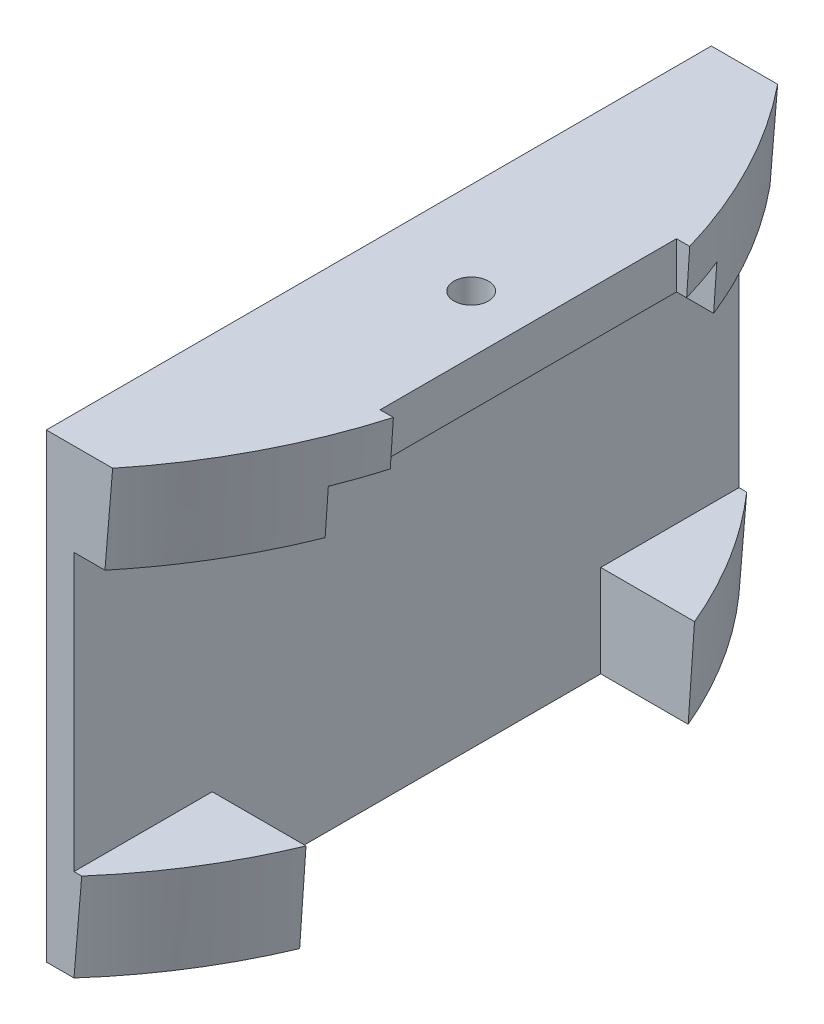
ISO-10303-21;
HEADER;
FILE_DESCRIPTION(('STEP AP214'),'2;1');
FILE_NAME('part.step','',(''),(''),'','','');
FILE_SCHEMA(('AUTOMOTIVE_DESIGN { 1 0 10303 214 1 1 1 1 }'));
ENDSEC;
DATA;
#1=APPLICATION_CONTEXT('core data for automotive mechanical design processes');
#2=APPLICATION_PROTOCOL_DEFINITION('international standard','automotive_design',2000,#1);
#3=PRODUCT_CONTEXT('',#1,'mechanical');
#4=PRODUCT('Part','Part','',(#3));
#5=PRODUCT_RELATED_PRODUCT_CATEGORY('part','',(#4));
#6=PRODUCT_DEFINITION_FORMATION('','',#4);
#7=PRODUCT_DEFINITION_CONTEXT('part definition',#1,'design');
#8=PRODUCT_DEFINITION('design','',#6,#7);
#9=PRODUCT_DEFINITION_SHAPE('','',#8);
#10=(LENGTH_UNIT() NAMED_UNIT(*) SI_UNIT(.MILLI.,.METRE.));
#11=(NAMED_UNIT(*) PLANE_ANGLE_UNIT() SI_UNIT($,.RADIAN.));
#12=(NAMED_UNIT(*) SI_UNIT($,.STERADIAN.) SOLID_ANGLE_UNIT());
#13=UNCERTAINTY_MEASURE_WITH_UNIT(LENGTH_MEASURE(1.E-05),#10,'distance_accuracy_value','');
#14=(GEOMETRIC_REPRESENTATION_CONTEXT(3) GLOBAL_UNCERTAINTY_ASSIGNED_CONTEXT((#13)) GLOBAL_UNIT_ASSIGNED_CONTEXT((#10,
#11,#12)) REPRESENTATION_CONTEXT('',''));
#15=CARTESIAN_POINT('',(0.,0.,0.));
#16=DIRECTION('',(0.,0.,1.));
#17=DIRECTION('',(1.,0.,0.));
#18=AXIS2_PLACEMENT_3D('',#15,#16,#17);
#19=CARTESIAN_POINT('',(51.3680584697573,0.,45.8196696304937));
#20=CARTESIAN_POINT('',(56.6981153033539,63.5,45.8196696304937));
#21=CARTESIAN_POINT('',(75.8413427747127,0.,18.3828699053536));
#22=CARTESIAN_POINT('',(79.2371077156288,63.5,17.9294992971375));
#23=CARTESIAN_POINT('',(75.8413427747127,0.,-18.3828699053536));
#24=CARTESIAN_POINT('',(79.2371077156288,63.5,-17.9294992971375));
#25=CARTESIAN_POINT('',(51.3680584697573,0.,-45.8196696304937));
#26=CARTESIAN_POINT('',(56.6981153033539,63.5,-45.8196696304937));
#27=(BOUNDED_SURFACE() B_SPLINE_SURFACE(3,1,((#19,#20),(#21,#22),(#23,#24),(#25,#26)),
.UNSPECIFIED.,.F.,.F.,.F.) B_SPLINE_SURFACE_WITH_KNOTS((4,4),(2,2),(0.,1.),(0.,1.),
.UNSPECIFIED.) GEOMETRIC_REPRESENTATION_ITEM() RATIONAL_B_SPLINE_SURFACE(((1.,1.),
(0.830839977043877,0.851848841791305),(0.830839977043877,0.851848841791305),(1.,1.))) REPRESENTATION_ITEM('') SURFACE());
#28=CARTESIAN_POINT('',(55.6321039366345,50.8,-45.8196696304937));
#29=CARTESIAN_POINT('',(56.497908368084,50.8,-44.7694605796605));
#30=CARTESIAN_POINT('',(57.3338879136072,50.8,-43.6946705729328));
#31=CARTESIAN_POINT('',(58.9440977250805,50.8,-41.4989027763207));
#32=CARTESIAN_POINT('',(59.7182946589383,50.8,-40.3779005426618));
#33=CARTESIAN_POINT('',(61.2021036492706,50.8,-38.0935118665906));
#34=CARTESIAN_POINT('',(61.9116984696572,50.8,-36.9301142281833));
#35=CARTESIAN_POINT('',(63.252519686937,50.8,-34.5846856778874));
#36=CARTESIAN_POINT('',(63.8848556064201,50.8,-33.4032890028458));
#37=CARTESIAN_POINT('',(65.082476259836,50.8,-31.007497624037));
#38=CARTESIAN_POINT('',(65.6477828435403,50.8,-29.7931138327185));
#39=CARTESIAN_POINT('',(66.709538823984,50.8,-27.3353827015068));
#40=CARTESIAN_POINT('',(67.2060307120814,50.8,-26.0920537935149));
#41=CARTESIAN_POINT('',(67.8052413600401,50.8,-24.4609603346704));
#42=CARTESIAN_POINT('',(67.9399122326129,50.8,-24.0847301337823));
#43=CARTESIAN_POINT('',(68.2029603334052,50.8,-23.3301221267811));
#44=CARTESIAN_POINT('',(68.3313384046149,50.8,-22.9517446159431));
#45=CARTESIAN_POINT('',(68.5822020018238,50.8,-22.1916277214967));
#46=CARTESIAN_POINT('',(68.704666183154,50.8,-21.8098813021193));
#47=CARTESIAN_POINT('',(68.9432198316352,50.8,-21.0443460046086));
#48=CARTESIAN_POINT('',(69.0593084466032,50.8,-20.6605568609208));
#49=CARTESIAN_POINT('',(69.1721844661229,50.8,-20.2758238921324));
#50=B_SPLINE_CURVE_WITH_KNOTS('',3,(#28,#29,#30,#31,#32,#33,#34,#35,#36,#37,#38,#39,#40,#41,#42,
#43,#44,#45,#46,#47,#48,#49),.UNSPECIFIED.,.F.,.F.,(4,2,2,2,2,2,2,2,2,2,4),(0.,4.08270614711515,
8.16760025355881,12.2535810506451,16.2714254319827,20.28795648173,24.3019962682621,
25.500784328937,26.6994113573589,27.9020828692834,29.1049147456352),.UNSPECIFIED.);
#51=CARTESIAN_POINT('',(55.6321039366345,50.8,-45.8196696304937));
#52=VERTEX_POINT('',#51);
#53=CARTESIAN_POINT('',(66.9253802718415,50.8,-26.7696696304937));
#54=VERTEX_POINT('',#53);
#55=EDGE_CURVE('E542',#52,#54,#50,.T.);
#56=DIRECTION('',(0.0836437610301086,0.99649572063343,0.));
#57=VECTOR('',#56,1.);
#58=CARTESIAN_POINT('',(54.0330868865556,31.75,-45.8196696304937));
#59=LINE('',#58,#57);
#60=CARTESIAN_POINT('',(56.6981153033539,63.5,-45.8196696304937));
#61=VERTEX_POINT('',#60);
#62=EDGE_CURVE('E298',#52,#61,#59,.T.);
#63=CARTESIAN_POINT('',(0.,63.5,0.));
#64=DIRECTION('',(0.,1.,0.));
#65=DIRECTION('',(0.,0.,1.));
#66=AXIS2_PLACEMENT_3D('',#63,#64,#65);
#67=CIRCLE('',#66,72.898);
#68=CARTESIAN_POINT('',(69.9796788547912,63.5,-20.4196696304937));
#69=VERTEX_POINT('',#68);
#70=EDGE_CURVE('E383',#69,#61,#67,.T.);
#71=CARTESIAN_POINT('',(69.9796791660371,63.5,-20.4196696304937));
#72=CARTESIAN_POINT('',(69.6749476855377,58.9475895332378,-20.4196696304937));
#73=CARTESIAN_POINT('',(69.3703155313551,54.3951724220756,-20.4196696304937));
#74=CARTESIAN_POINT('',(68.7612498756235,45.2903249109514,-20.4196696304937));
#75=CARTESIAN_POINT('',(68.4568163740745,40.7378945109893,-20.4196696304937));
#76=CARTESIAN_POINT('',(68.1524821988424,36.1854574666273,-20.4196696304937));
#77=B_SPLINE_CURVE_WITH_KNOTS('',3,(#71,#72,#73,#74,#75,#76),.UNSPECIFIED.,.F.,.F.,(4,2,4),(0.,
13.6877945897167,27.3755891794333),.UNSPECIFIED.);
#78=CARTESIAN_POINT('',(69.5546840336311,57.15,-20.4196696304937));
#79=VERTEX_POINT('',#78);
#80=EDGE_CURVE('E228',#69,#79,#77,.T.);
#81=CARTESIAN_POINT('',(67.3650346924501,57.15,26.7696696304937));
#82=CARTESIAN_POINT('',(67.7411460159018,57.15,25.8237190961142));
#83=CARTESIAN_POINT('',(68.0972983772991,57.15,24.8698342132706));
#84=CARTESIAN_POINT('',(68.7691054061984,57.15,22.9479181310189));
#85=CARTESIAN_POINT('',(69.084760442982,57.15,21.9798870606949));
#86=CARTESIAN_POINT('',(69.6749992556651,57.15,20.0313859066843));
#87=CARTESIAN_POINT('',(69.9495831259176,57.15,19.0509158515794));
#88=CARTESIAN_POINT('',(70.4571972371561,57.15,17.0792728656308));
#89=CARTESIAN_POINT('',(70.6902272866677,57.15,16.0880998854917));
#90=CARTESIAN_POINT('',(71.114554906625,57.15,14.0956954395073));
#91=CARTESIAN_POINT('',(71.3058052769937,57.15,13.0944539204511));
#92=CARTESIAN_POINT('',(71.6458967582875,57.15,11.0848155340853));
#93=CARTESIAN_POINT('',(71.7947386819823,57.15,10.0764188042869));
#94=CARTESIAN_POINT('',(72.0497489791781,57.15,8.05426586707902));
#95=CARTESIAN_POINT('',(72.1559185289903,57.15,7.04050980818592));
#96=CARTESIAN_POINT('',(72.3253982746394,57.15,5.00948176657829));
#97=CARTESIAN_POINT('',(72.3887100225621,57.15,3.99220991252867));
#98=CARTESIAN_POINT('',(72.4863387624392,57.15,1.61564774644313));
#99=CARTESIAN_POINT('',(72.5039025678789,57.15,0.255635089755667));
#100=CARTESIAN_POINT('',(72.4624803083652,57.15,-2.46325768152241));
#101=CARTESIAN_POINT('',(72.4034900288574,57.15,-3.82213772963784));
#102=CARTESIAN_POINT('',(72.2091307463837,57.15,-6.53463440636639));
#103=CARTESIAN_POINT('',(72.0737505495139,57.15,-7.88825023430229));
#104=CARTESIAN_POINT('',(71.7274147059183,57.15,-10.5827216569042));
#105=CARTESIAN_POINT('',(71.5166278106926,57.15,-11.9235989352914));
#106=CARTESIAN_POINT('',(71.0201472784015,57.15,-14.5911671693912));
#107=CARTESIAN_POINT('',(70.7344654604159,57.15,-15.9178603291319));
#108=CARTESIAN_POINT('',(70.0892258904803,57.15,-18.552457885756));
#109=CARTESIAN_POINT('',(69.7297106948473,57.15,-19.860372643632));
#110=CARTESIAN_POINT('',(69.1889805906471,57.15,-21.6315082034966));
#111=CARTESIAN_POINT('',(69.0392412485226,57.15,-22.1045154046806));
#112=CARTESIAN_POINT('',(68.7301035194749,57.15,-23.0472827867813));
#113=CARTESIAN_POINT('',(68.5707068846321,57.15,-23.5170435395603));
#114=CARTESIAN_POINT('',(68.2424855733698,57.15,-24.4526637787048));
#115=CARTESIAN_POINT('',(68.0736716818402,57.15,-24.9185270526523));
#116=CARTESIAN_POINT('',(67.7264931972547,57.15,-25.8467762034833));
#117=CARTESIAN_POINT('',(67.5481268998495,57.15,-26.3091614429159));
#118=CARTESIAN_POINT('',(67.3650346924501,57.15,-26.7696696304937));
#119=B_SPLINE_CURVE_WITH_KNOTS('',3,(#81,#82,#83,#84,#85,#86,#87,#88,#89,#90,#91,#92,#93,#94,
#95,#96,#97,#98,#99,#100,#101,#102,#103,#104,#105,#106,#107,#108,#109,#110,#111,#112,#113,#114,
#115,#116,#117,#118),.UNSPECIFIED.,.F.,.F.,(4,2,2,2,2,2,2,2,2,2,2,2,2,2,2,2,2,2,4),(0.,
3.05371064757176,6.10739344739349,9.16106923186193,12.2147590868853,15.2718811712091,
18.3289446609978,21.3859238736832,24.4427923726147,28.5209179060169,32.5992679631736,
36.6782158023411,40.7480919498584,44.8173262212102,48.8842216040591,50.3725784550399,
51.8606660838535,53.3470831712097,54.8337663558255),.UNSPECIFIED.);
#120=CARTESIAN_POINT('',(67.3650346924501,57.15,-26.7696696304937));
#121=VERTEX_POINT('',#120);
#122=EDGE_CURVE('E275',#79,#121,#119,.T.);
#123=CARTESIAN_POINT('',(63.4153320883382,0.,-26.7696696304937));
#124=CARTESIAN_POINT('',(64.0722790866244,9.52509229181283,-26.7696696304937));
#125=CARTESIAN_POINT('',(64.7298944662095,19.050138391021,-26.7696696304937));
#126=CARTESIAN_POINT('',(66.0464620008872,38.1001383910228,-26.7696696304937));
#127=CARTESIAN_POINT('',(66.7054141560061,47.6250922918147,-26.7696696304937));
#128=CARTESIAN_POINT('',(67.3650346924501,57.15,-26.7696696304937));
#129=B_SPLINE_CURVE_WITH_KNOTS('',3,(#123,#124,#125,#126,#127,#128),.UNSPECIFIED.,.F.,.F.,(4,2,
4),(0.,28.6431606254541,57.2863218126295),.UNSPECIFIED.);
#130=EDGE_CURVE('E274',#54,#121,#129,.T.);
#131=ORIENTED_EDGE('',*,*,#55,.F.);
#132=ORIENTED_EDGE('',*,*,#62,.T.);
#133=ORIENTED_EDGE('',*,*,#70,.F.);
#134=ORIENTED_EDGE('',*,*,#80,.T.);
#135=ORIENTED_EDGE('',*,*,#122,.T.);
#136=ORIENTED_EDGE('',*,*,#130,.F.);
#137=EDGE_LOOP('',(#131,#132,#133,#134,#135,#136));
#138=FACE_BOUND('',#137,.T.);
#139=ADVANCED_FACE('F44',(#138),#27,.T.);
#140=CARTESIAN_POINT('',(69.1721844661229,50.8,20.2758238921323));
#141=CARTESIAN_POINT('',(68.7890499407735,50.8,21.5818768298051));
#142=CARTESIAN_POINT('',(68.3688129929237,50.8,22.8770393446531));
#143=CARTESIAN_POINT('',(67.4554297473611,50.8,25.4421717200295));
#144=CARTESIAN_POINT('',(66.9622448285752,50.8,26.7121278290174));
#145=CARTESIAN_POINT('',(65.9045315665793,50.8,29.222371141385));
#146=CARTESIAN_POINT('',(65.33998437336,50.8,30.4626504024415));
#147=CARTESIAN_POINT('',(64.151473582279,50.8,32.8888114524856));
#148=CARTESIAN_POINT('',(63.5286574561361,50.8,34.0752554073096));
#149=CARTESIAN_POINT('',(62.2180829406557,50.8,36.4111757374231));
#150=CARTESIAN_POINT('',(61.5303457674589,50.8,37.5606640262958));
#151=CARTESIAN_POINT('',(60.0922628164254,50.8,39.8189189019977));
#152=CARTESIAN_POINT('',(59.3419561006168,50.8,40.927710282237));
#153=CARTESIAN_POINT('',(58.3284014751663,50.8,42.3391762862144));
#154=CARTESIAN_POINT('',(58.0926258471345,50.8,42.6618138446394));
#155=CARTESIAN_POINT('',(57.6157664740547,50.8,43.3030872140876));
#156=CARTESIAN_POINT('',(57.3746834472036,50.8,43.6217235575019));
#157=CARTESIAN_POINT('',(56.8864297870776,50.8,44.2560080907484));
#158=CARTESIAN_POINT('',(56.6392413607275,50.8,44.5716425735946));
#159=CARTESIAN_POINT('',(56.1395981364055,50.8,45.1987842489404));
#160=CARTESIAN_POINT('',(55.8871426398372,50.8,45.5102908848689));
#161=CARTESIAN_POINT('',(55.6321039366346,50.8,45.8196696304937));
#162=B_SPLINE_CURVE_WITH_KNOTS('',3,(#140,#141,#142,#143,#144,#145,#146,#147,#148,#149,#150,
#151,#152,#153,#154,#155,#156,#157,#158,#159,#160,#161),.UNSPECIFIED.,.F.,.F.,(4,2,2,2,2,2,2,2,
2,2,4),(0.,4.08271567284874,8.16760065929459,12.2535669125204,16.2714139012287,20.2879523769718,
24.3020018439877,25.5007889320795,26.6994147855325,27.9020842518857,29.1049142610503),.UNSPECIFIED.);
#163=CARTESIAN_POINT('',(66.9253802718415,50.8,26.7696696304937));
#164=VERTEX_POINT('',#163);
#165=CARTESIAN_POINT('',(55.6321039366346,50.8,45.8196696304937));
#166=VERTEX_POINT('',#165);
#167=EDGE_CURVE('E214',#164,#166,#162,.T.);
#168=CARTESIAN_POINT('',(63.4153320883382,0.,26.7696696304937));
#169=CARTESIAN_POINT('',(64.0722790866244,9.52509229181282,26.7696696304937));
#170=CARTESIAN_POINT('',(64.7298944662095,19.050138391021,26.7696696304937));
#171=CARTESIAN_POINT('',(66.0464620008872,38.1001383910228,26.7696696304937));
#172=CARTESIAN_POINT('',(66.7054141560061,47.6250922918146,26.7696696304937));
#173=CARTESIAN_POINT('',(67.3650346924501,57.15,26.7696696304937));
#174=B_SPLINE_CURVE_WITH_KNOTS('',3,(#168,#169,#170,#171,#172,#173),.UNSPECIFIED.,.F.,.F.,(4,2,
4),(0.,28.6431606254541,57.2863218126295),.UNSPECIFIED.);
#175=CARTESIAN_POINT('',(67.3650346924501,57.15,26.7696696304937));
#176=VERTEX_POINT('',#175);
#177=EDGE_CURVE('E282',#164,#176,#174,.T.);
#178=CARTESIAN_POINT('',(69.5546840336311,57.15,20.4196696304937));
#179=VERTEX_POINT('',#178);
#180=EDGE_CURVE('E266',#176,#179,#119,.T.);
#181=CARTESIAN_POINT('',(69.9796791660371,63.5,20.4196696304937));
#182=CARTESIAN_POINT('',(69.6749476855377,58.9475895332378,20.4196696304937));
#183=CARTESIAN_POINT('',(69.3703155313551,54.3951724220756,20.4196696304937));
#184=CARTESIAN_POINT('',(68.7612498756235,45.2903249109513,20.4196696304937));
#185=CARTESIAN_POINT('',(68.4568163740746,40.7378945109892,20.4196696304937));
#186=CARTESIAN_POINT('',(68.1524821988424,36.1854574666272,20.4196696304937));
#187=B_SPLINE_CURVE_WITH_KNOTS('',3,(#181,#182,#183,#184,#185,#186),.UNSPECIFIED.,.F.,.F.,(4,2,
4),(0.,13.6877945897167,27.3755891794334),.UNSPECIFIED.);
#188=CARTESIAN_POINT('',(69.9796823682284,63.5,20.4196696304937));
#189=VERTEX_POINT('',#188);
#190=EDGE_CURVE('E231',#189,#179,#187,.T.);
#191=CARTESIAN_POINT('',(56.6981153033539,63.5,45.8196696304937));
#192=VERTEX_POINT('',#191);
#193=EDGE_CURVE('E295',#192,#189,#67,.T.);
#194=DIRECTION('',(0.0836437610301085,0.99649572063343,0.));
#195=VECTOR('',#194,1.);
#196=CARTESIAN_POINT('',(51.3680584697573,0.,45.8196696304937));
#197=LINE('',#196,#195);
#198=EDGE_CURVE('E49',#166,#192,#197,.T.);
#199=ORIENTED_EDGE('',*,*,#167,.F.);
#200=ORIENTED_EDGE('',*,*,#177,.T.);
#201=ORIENTED_EDGE('',*,*,#180,.T.);
#202=ORIENTED_EDGE('',*,*,#190,.F.);
#203=ORIENTED_EDGE('',*,*,#193,.F.);
#204=ORIENTED_EDGE('',*,*,#198,.F.);
#205=EDGE_LOOP('',(#199,#200,#201,#202,#203,#204));
#206=FACE_BOUND('',#205,.T.);
#207=ADVANCED_FACE('F446',(#206),#27,.T.);
#208=CARTESIAN_POINT('',(0.,57.15,26.7696696304937));
#209=DIRECTION('',(0.,0.,-1.));
#210=DIRECTION('',(-1.,0.,0.));
#211=AXIS2_PLACEMENT_3D('',#208,#209,#210);
#212=PLANE('',#211);
#213=DIRECTION('',(1.,0.,0.));
#214=VECTOR('',#213,1.);
#215=CARTESIAN_POINT('',(0.,50.8,26.7696696304937));
#216=LINE('',#215,#214);
#217=CARTESIAN_POINT('',(51.3680584697573,50.8,26.7696696304937));
#218=VERTEX_POINT('',#217);
#219=EDGE_CURVE('E549',#218,#164,#216,.T.);
#220=ORIENTED_EDGE('',*,*,#219,.F.);
#221=DIRECTION('',(0.,-1.,0.));
#222=VECTOR('',#221,1.);
#223=CARTESIAN_POINT('',(51.3680584697573,57.15,26.7696696304937));
#224=LINE('',#223,#222);
#225=CARTESIAN_POINT('',(51.3680584697573,57.15,26.7696696304937));
#226=VERTEX_POINT('',#225);
#227=EDGE_CURVE('E488',#226,#218,#224,.T.);
#228=ORIENTED_EDGE('',*,*,#227,.F.);
#229=DIRECTION('',(1.,0.,0.));
#230=VECTOR('',#229,1.);
#231=CARTESIAN_POINT('',(0.,57.15,26.7696696304937));
#232=LINE('',#231,#230);
#233=EDGE_CURVE('E471',#226,#176,#232,.T.);
#234=ORIENTED_EDGE('',*,*,#233,.T.);
#235=ORIENTED_EDGE('',*,*,#177,.F.);
#236=EDGE_LOOP('',(#220,#228,#234,#235));
#237=FACE_BOUND('',#236,.T.);
#238=ADVANCED_FACE('F316',(#237),#212,.T.);
#239=CARTESIAN_POINT('',(0.,57.15,-26.7696696304937));
#240=DIRECTION('',(0.,0.,-1.));
#241=DIRECTION('',(-1.,0.,0.));
#242=AXIS2_PLACEMENT_3D('',#239,#240,#241);
#243=PLANE('',#242);
#244=DIRECTION('',(0.,-1.,0.));
#245=VECTOR('',#244,1.);
#246=CARTESIAN_POINT('',(51.3680584697574,57.15,-26.7696696304937));
#247=LINE('',#246,#245);
#248=CARTESIAN_POINT('',(51.3680584697574,57.15,-26.7696696304937));
#249=VERTEX_POINT('',#248);
#250=CARTESIAN_POINT('',(51.3680584697573,50.8,-26.7696696304937));
#251=VERTEX_POINT('',#250);
#252=EDGE_CURVE('E371',#249,#251,#247,.T.);
#253=ORIENTED_EDGE('',*,*,#252,.T.);
#254=DIRECTION('',(1.,0.,0.));
#255=VECTOR('',#254,1.);
#256=CARTESIAN_POINT('',(0.,50.8,-26.7696696304937));
#257=LINE('',#256,#255);
#258=EDGE_CURVE('E539',#251,#54,#257,.T.);
#259=ORIENTED_EDGE('',*,*,#258,.T.);
#260=ORIENTED_EDGE('',*,*,#130,.T.);
#261=DIRECTION('',(1.,0.,0.));
#262=VECTOR('',#261,1.);
#263=CARTESIAN_POINT('',(0.,57.15,-26.7696696304937));
#264=LINE('',#263,#262);
#265=EDGE_CURVE('E493',#249,#121,#264,.T.);
#266=ORIENTED_EDGE('',*,*,#265,.F.);
#267=EDGE_LOOP('',(#253,#259,#260,#266));
#268=FACE_BOUND('',#267,.T.);
#269=ADVANCED_FACE('F460',(#268),#243,.F.);
#270=CARTESIAN_POINT('',(66.5723135146819,12.7,-20.4555103290778));
#271=CARTESIAN_POINT('',(66.1856502337997,12.7,-21.7129181344014));
#272=CARTESIAN_POINT('',(65.7632541532432,12.7,-22.9593315428074));
#273=CARTESIAN_POINT('',(64.8483094879216,12.7,-25.4268378925729));
#274=CARTESIAN_POINT('',(64.3557264567147,12.7,-26.6479180617382));
#275=CARTESIAN_POINT('',(63.3019757531598,12.7,-29.0604755538159));
#276=CARTESIAN_POINT('',(62.740791303523,12.7,-30.2519455491363));
#277=CARTESIAN_POINT('',(61.5620608571998,12.7,-32.5807827925924));
#278=CARTESIAN_POINT('',(60.9456601822129,12.7,-33.7187298145751));
#279=CARTESIAN_POINT('',(59.6506150591967,12.7,-35.9581426451127));
#280=CARTESIAN_POINT('',(58.9719897862136,12.7,-37.0596195507854));
#281=CARTESIAN_POINT('',(57.5547858413439,12.7,-39.2225045674054));
#282=CARTESIAN_POINT('',(56.8162422979353,12.7,-40.2839356289554));
#283=CARTESIAN_POINT('',(55.763899123842,12.7,-41.7099658367448));
#284=CARTESIAN_POINT('',(55.4749804175874,12.7,-42.0931206117331));
#285=CARTESIAN_POINT('',(54.8893207060376,12.7,-42.8533258493937));
#286=CARTESIAN_POINT('',(54.5925809324625,12.7,-43.2303772583499));
#287=CARTESIAN_POINT('',(53.9900599329966,12.7,-43.979893608158));
#288=CARTESIAN_POINT('',(53.6842449073304,12.7,-44.3523313600675));
#289=CARTESIAN_POINT('',(53.0649002920439,12.7,-45.090834723148));
#290=CARTESIAN_POINT('',(52.7513695117862,12.7,-45.4568993357931));
#291=CARTESIAN_POINT('',(52.4340698364766,12.7,-45.8196696304937));
#292=B_SPLINE_CURVE_WITH_KNOTS('',3,(#270,#271,#272,#273,#274,#275,#276,#277,#278,#279,#280,
#281,#282,#283,#284,#285,#286,#287,#288,#289,#290,#291),.UNSPECIFIED.,.F.,.F.,(4,2,2,2,2,2,2,2,
2,2,4),(0.,3.94601181867589,7.89396697960341,11.8428895985965,15.723375504018,19.6026695975417,
23.479705575766,24.9192646060437,26.3585982627226,27.8042118634496,29.2500499568141),.UNSPECIFIED.);
#293=CARTESIAN_POINT('',(64.2916542193554,12.7,-26.7696696304937));
#294=VERTEX_POINT('',#293);
#295=CARTESIAN_POINT('',(52.4340698364766,12.7,-45.8196696304937));
#296=VERTEX_POINT('',#295);
#297=EDGE_CURVE('E185',#294,#296,#292,.T.);
#298=CARTESIAN_POINT('',(63.4153320883382,0.,-26.7696696304937));
#299=VERTEX_POINT('',#298);
#300=EDGE_CURVE('E279',#299,#294,#129,.T.);
#301=CARTESIAN_POINT('',(0.,0.,0.));
#302=DIRECTION('',(0.,1.,0.));
#303=DIRECTION('',(0.,0.,1.));
#304=AXIS2_PLACEMENT_3D('',#301,#302,#303);
#305=CIRCLE('',#304,68.834);
#306=CARTESIAN_POINT('',(51.3680584697573,0.,-45.8196696304937));
#307=VERTEX_POINT('',#306);
#308=EDGE_CURVE('E369',#299,#307,#305,.T.);
#309=EDGE_CURVE('E415',#307,#296,#59,.T.);
#310=ORIENTED_EDGE('',*,*,#297,.F.);
#311=ORIENTED_EDGE('',*,*,#300,.F.);
#312=ORIENTED_EDGE('',*,*,#308,.T.);
#313=ORIENTED_EDGE('',*,*,#309,.T.);
#314=EDGE_LOOP('',(#310,#311,#312,#313));
#315=FACE_BOUND('',#314,.T.);
#316=ADVANCED_FACE('F321',(#315),#27,.T.);
#317=CARTESIAN_POINT('',(0.,0.,0.));
#318=DIRECTION('',(0.,1.,0.));
#319=DIRECTION('',(0.,0.,1.));
#320=AXIS2_PLACEMENT_3D('',#317,#318,#319);
#321=PLANE('',#320);
#322=DIRECTION('',(1.,0.,0.));
#323=VECTOR('',#322,1.);
#324=CARTESIAN_POINT('',(0.,0.,26.7696696304937));
#325=LINE('',#324,#323);
#326=CARTESIAN_POINT('',(51.3680584697573,0.,26.7696696304937));
#327=VERTEX_POINT('',#326);
#328=CARTESIAN_POINT('',(63.4153320883382,0.,26.7696696304937));
#329=VERTEX_POINT('',#328);
#330=EDGE_CURVE('E477',#327,#329,#325,.T.);
#331=ORIENTED_EDGE('',*,*,#330,.T.);
#332=CARTESIAN_POINT('',(51.3680584697573,0.,45.8196696304937));
#333=VERTEX_POINT('',#332);
#334=EDGE_CURVE('E307',#333,#329,#305,.T.);
#335=ORIENTED_EDGE('',*,*,#334,.F.);
#336=DIRECTION('',(1.,0.,0.));
#337=VECTOR('',#336,1.);
#338=CARTESIAN_POINT('',(47.5580584697573,0.,45.8196696304937));
#339=LINE('',#338,#337);
#340=CARTESIAN_POINT('',(47.5580584697573,0.,45.8196696304937));
#341=VERTEX_POINT('',#340);
#342=EDGE_CURVE('E357',#341,#333,#339,.T.);
#343=ORIENTED_EDGE('',*,*,#342,.F.);
#344=DIRECTION('',(0.,0.,1.));
#345=VECTOR('',#344,1.);
#346=CARTESIAN_POINT('',(47.5580584697573,0.,-45.8196696304937));
#347=LINE('',#346,#345);
#348=CARTESIAN_POINT('',(47.5580584697573,0.,-45.8196696304937));
#349=VERTEX_POINT('',#348);
#350=EDGE_CURVE('E353',#349,#341,#347,.T.);
#351=ORIENTED_EDGE('',*,*,#350,.F.);
#352=DIRECTION('',(-1.,0.,0.));
#353=VECTOR('',#352,1.);
#354=CARTESIAN_POINT('',(47.5580584697573,0.,-45.8196696304937));
#355=LINE('',#354,#353);
#356=EDGE_CURVE('E345',#307,#349,#355,.T.);
#357=ORIENTED_EDGE('',*,*,#356,.F.);
#358=ORIENTED_EDGE('',*,*,#308,.F.);
#359=DIRECTION('',(1.,0.,0.));
#360=VECTOR('',#359,1.);
#361=CARTESIAN_POINT('',(0.,0.,-26.7696696304937));
#362=LINE('',#361,#360);
#363=CARTESIAN_POINT('',(51.3680584697574,0.,-26.7696696304937));
#364=VERTEX_POINT('',#363);
#365=EDGE_CURVE('E469',#364,#299,#362,.T.);
#366=ORIENTED_EDGE('',*,*,#365,.F.);
#367=DIRECTION('',(0.,0.,-1.));
#368=VECTOR('',#367,1.);
#369=CARTESIAN_POINT('',(51.3680584697574,0.,0.));
#370=LINE('',#369,#368);
#371=EDGE_CURVE('E472',#327,#364,#370,.T.);
#372=ORIENTED_EDGE('',*,*,#371,.F.);
#373=EDGE_LOOP('',(#331,#335,#343,#351,#357,#358,#366,#372));
#374=FACE_BOUND('',#373,.T.);
#375=ADVANCED_FACE('F317',(#374),#321,.F.);
#376=CARTESIAN_POINT('',(52.4340698364766,12.7,45.8196696304937));
#377=CARTESIAN_POINT('',(53.3001802010006,12.7,44.8295041720995));
#378=CARTESIAN_POINT('',(54.1381597796842,12.7,43.8147395758166));
#379=CARTESIAN_POINT('',(55.7557119364048,12.7,41.738869580917));
#380=CARTESIAN_POINT('',(56.5352553057564,12.7,40.6777414219196));
#381=CARTESIAN_POINT('',(58.0331087924609,12.7,38.512725282661));
#382=CARTESIAN_POINT('',(58.7514037847914,12.7,37.4088268377816));
#383=CARTESIAN_POINT('',(60.112339336137,12.7,35.1815500760712));
#384=CARTESIAN_POINT('',(60.756075469903,12.7,34.0588411148621));
#385=CARTESIAN_POINT('',(61.9797828069508,12.7,31.7796660506659));
#386=CARTESIAN_POINT('',(62.559773600985,12.7,30.6232104580268));
#387=CARTESIAN_POINT('',(63.6541357850421,12.7,28.2803730350827));
#388=CARTESIAN_POINT('',(64.1685452073858,12.7,27.0940090320028));
#389=CARTESIAN_POINT('',(64.828028933395,12.7,25.448998251587));
#390=CARTESIAN_POINT('',(65.0019781830251,12.7,25.0017586244193));
#391=CARTESIAN_POINT('',(65.3405680453479,12.7,24.1038352311347));
#392=CARTESIAN_POINT('',(65.5052101094701,12.7,23.6531520145491));
#393=CARTESIAN_POINT('',(65.8258350739736,12.7,22.7465059698295));
#394=CARTESIAN_POINT('',(65.98177705158,12.7,22.2905286846842));
#395=CARTESIAN_POINT('',(66.284180235534,12.7,21.3753625936725));
#396=CARTESIAN_POINT('',(66.4306399671753,12.7,20.9161733005113));
#397=CARTESIAN_POINT('',(66.5723135146819,12.7,20.4555103290778));
#398=B_SPLINE_CURVE_WITH_KNOTS('',3,(#376,#377,#378,#379,#380,#381,#382,#383,#384,#385,#386,
#387,#388,#389,#390,#391,#392,#393,#394,#395,#396,#397),.UNSPECIFIED.,.F.,.F.,(4,2,2,2,2,2,2,2,
2,2,4),(0.,3.94600388929296,7.89396717183671,11.8429025803346,15.7233867421818,19.6026749665323,
23.4797031582991,24.9192622153364,26.3585961543009,27.8042111554125,29.2500504453347),.UNSPECIFIED.);
#399=CARTESIAN_POINT('',(52.4340698364766,12.7,45.8196696304937));
#400=VERTEX_POINT('',#399);
#401=CARTESIAN_POINT('',(64.2916542193554,12.7,26.7696696304937));
#402=VERTEX_POINT('',#401);
#403=EDGE_CURVE('E63',#400,#402,#398,.T.);
#404=EDGE_CURVE('E565',#333,#400,#197,.T.);
#405=EDGE_CURVE('E289',#329,#402,#174,.T.);
#406=ORIENTED_EDGE('',*,*,#403,.F.);
#407=ORIENTED_EDGE('',*,*,#404,.F.);
#408=ORIENTED_EDGE('',*,*,#334,.T.);
#409=ORIENTED_EDGE('',*,*,#405,.T.);
#410=EDGE_LOOP('',(#406,#407,#408,#409));
#411=FACE_BOUND('',#410,.T.);
#412=ADVANCED_FACE('F243',(#411),#27,.T.);
#413=CARTESIAN_POINT('',(0.,63.5,0.));
#414=DIRECTION('',(0.,1.,0.));
#415=DIRECTION('',(0.,0.,1.));
#416=AXIS2_PLACEMENT_3D('',#413,#414,#415);
#417=PLANE('',#416);
#418=CARTESIAN_POINT('',(60.2580584697573,63.5,-0.0273303695062649));
#419=DIRECTION('',(0.,1.,0.));
#420=DIRECTION('',(0.,0.,1.));
#421=AXIS2_PLACEMENT_3D('',#418,#419,#420);
#422=CIRCLE('',#421,2.38125000000001);
#423=CARTESIAN_POINT('',(60.2580584697573,63.5,2.35391963049374));
#424=VERTEX_POINT('',#423);
#425=EDGE_CURVE('E628',#424,#424,#422,.T.);
#426=ORIENTED_EDGE('',*,*,#425,.F.);
#427=EDGE_LOOP('',(#426));
#428=FACE_BOUND('',#427,.T.);
#429=DIRECTION('',(1.,0.,0.));
#430=VECTOR('',#429,1.);
#431=CARTESIAN_POINT('',(0.,63.5,20.4196696304937));
#432=LINE('',#431,#430);
#433=CARTESIAN_POINT('',(68.1524821988424,63.5,20.4196696304937));
#434=VERTEX_POINT('',#433);
#435=EDGE_CURVE('E241',#434,#189,#432,.T.);
#436=ORIENTED_EDGE('',*,*,#435,.F.);
#437=DIRECTION('',(0.,0.,1.));
#438=VECTOR('',#437,1.);
#439=CARTESIAN_POINT('',(68.1524821988424,63.5,0.));
#440=LINE('',#439,#438);
#441=CARTESIAN_POINT('',(68.1524821988424,63.5,-20.4196696304937));
#442=VERTEX_POINT('',#441);
#443=EDGE_CURVE('E220',#442,#434,#440,.T.);
#444=ORIENTED_EDGE('',*,*,#443,.F.);
#445=DIRECTION('',(1.,0.,0.));
#446=VECTOR('',#445,1.);
#447=CARTESIAN_POINT('',(0.,63.5,-20.4196696304937));
#448=LINE('',#447,#446);
#449=EDGE_CURVE('E211',#442,#69,#448,.T.);
#450=ORIENTED_EDGE('',*,*,#449,.T.);
#451=ORIENTED_EDGE('',*,*,#70,.T.);
#452=DIRECTION('',(-1.,0.,0.));
#453=VECTOR('',#452,1.);
#454=CARTESIAN_POINT('',(47.5580584697573,63.5,-45.8196696304937));
#455=LINE('',#454,#453);
#456=CARTESIAN_POINT('',(47.5580584697573,63.5,-45.8196696304937));
#457=VERTEX_POINT('',#456);
#458=EDGE_CURVE('E399',#61,#457,#455,.T.);
#459=ORIENTED_EDGE('',*,*,#458,.T.);
#460=DIRECTION('',(0.,0.,1.));
#461=VECTOR('',#460,1.);
#462=CARTESIAN_POINT('',(47.5580584697573,63.5,-45.8196696304937));
#463=LINE('',#462,#461);
#464=CARTESIAN_POINT('',(47.5580584697573,63.5,45.8196696304937));
#465=VERTEX_POINT('',#464);
#466=EDGE_CURVE('E647',#457,#465,#463,.T.);
#467=ORIENTED_EDGE('',*,*,#466,.T.);
#468=DIRECTION('',(1.,0.,0.));
#469=VECTOR('',#468,1.);
#470=CARTESIAN_POINT('',(47.5580584697573,63.5,45.8196696304937));
#471=LINE('',#470,#469);
#472=EDGE_CURVE('E604',#465,#192,#471,.T.);
#473=ORIENTED_EDGE('',*,*,#472,.T.);
#474=ORIENTED_EDGE('',*,*,#193,.T.);
#475=EDGE_LOOP('',(#436,#444,#450,#451,#459,#467,#473,#474));
#476=FACE_BOUND('',#475,.T.);
#477=ADVANCED_FACE('F46',(#428,#476),#417,.T.);
#478=CARTESIAN_POINT('',(0.,0.,45.8196696304937));
#479=DIRECTION('',(0.,0.,-1.));
#480=DIRECTION('',(-1.,0.,0.));
#481=AXIS2_PLACEMENT_3D('',#478,#479,#480);
#482=PLANE('',#481);
#483=DIRECTION('',(0.,1.,0.));
#484=VECTOR('',#483,1.);
#485=CARTESIAN_POINT('',(51.3680584697573,0.,45.8196696304937));
#486=LINE('',#485,#484);
#487=CARTESIAN_POINT('',(51.3680584697573,12.7,45.8196696304937));
#488=VERTEX_POINT('',#487);
#489=CARTESIAN_POINT('',(51.3680584697573,50.8,45.8196696304937));
#490=VERTEX_POINT('',#489);
#491=EDGE_CURVE('E207',#488,#490,#486,.T.);
#492=ORIENTED_EDGE('',*,*,#491,.T.);
#493=DIRECTION('',(1.,0.,0.));
#494=VECTOR('',#493,1.);
#495=CARTESIAN_POINT('',(0.,50.8,45.8196696304937));
#496=LINE('',#495,#494);
#497=EDGE_CURVE('E208',#490,#166,#496,.T.);
#498=ORIENTED_EDGE('',*,*,#497,.T.);
#499=ORIENTED_EDGE('',*,*,#198,.T.);
#500=ORIENTED_EDGE('',*,*,#472,.F.);
#501=DIRECTION('',(0.,1.,0.));
#502=VECTOR('',#501,1.);
#503=CARTESIAN_POINT('',(47.5580584697573,0.,45.8196696304937));
#504=LINE('',#503,#502);
#505=EDGE_CURVE('E567',#341,#465,#504,.T.);
#506=ORIENTED_EDGE('',*,*,#505,.F.);
#507=ORIENTED_EDGE('',*,*,#342,.T.);
#508=ORIENTED_EDGE('',*,*,#404,.T.);
#509=DIRECTION('',(-1.,0.,0.));
#510=VECTOR('',#509,1.);
#511=CARTESIAN_POINT('',(0.,12.7,45.8196696304937));
#512=LINE('',#511,#510);
#513=EDGE_CURVE('E536',#400,#488,#512,.T.);
#514=ORIENTED_EDGE('',*,*,#513,.T.);
#515=EDGE_LOOP('',(#492,#498,#499,#500,#506,#507,#508,#514));
#516=FACE_BOUND('',#515,.T.);
#517=ADVANCED_FACE('F323',(#516),#482,.F.);
#518=CARTESIAN_POINT('',(47.5580584697573,0.,0.));
#519=DIRECTION('',(1.,0.,0.));
#520=DIRECTION('',(0.,0.,-1.));
#521=AXIS2_PLACEMENT_3D('',#518,#519,#520);
#522=PLANE('',#521);
#523=ORIENTED_EDGE('',*,*,#505,.T.);
#524=ORIENTED_EDGE('',*,*,#466,.F.);
#525=DIRECTION('',(0.,1.,0.));
#526=VECTOR('',#525,1.);
#527=CARTESIAN_POINT('',(47.5580584697573,0.,-45.8196696304937));
#528=LINE('',#527,#526);
#529=EDGE_CURVE('E422',#349,#457,#528,.T.);
#530=ORIENTED_EDGE('',*,*,#529,.F.);
#531=ORIENTED_EDGE('',*,*,#350,.T.);
#532=EDGE_LOOP('',(#523,#524,#530,#531));
#533=FACE_BOUND('',#532,.T.);
#534=ADVANCED_FACE('F439',(#533),#522,.F.);
#535=CARTESIAN_POINT('',(0.,0.,-45.8196696304937));
#536=DIRECTION('',(0.,0.,1.));
#537=DIRECTION('',(1.,0.,0.));
#538=AXIS2_PLACEMENT_3D('',#535,#536,#537);
#539=PLANE('',#538);
#540=ORIENTED_EDGE('',*,*,#62,.F.);
#541=DIRECTION('',(-1.,0.,0.));
#542=VECTOR('',#541,1.);
#543=CARTESIAN_POINT('',(0.,50.8,-45.8196696304937));
#544=LINE('',#543,#542);
#545=CARTESIAN_POINT('',(51.3680584697573,50.8,-45.8196696304937));
#546=VERTEX_POINT('',#545);
#547=EDGE_CURVE('E206',#52,#546,#544,.T.);
#548=ORIENTED_EDGE('',*,*,#547,.T.);
#549=DIRECTION('',(0.,-1.,0.));
#550=VECTOR('',#549,1.);
#551=CARTESIAN_POINT('',(51.3680584697573,0.,-45.8196696304937));
#552=LINE('',#551,#550);
#553=CARTESIAN_POINT('',(51.3680584697573,12.7,-45.8196696304937));
#554=VERTEX_POINT('',#553);
#555=EDGE_CURVE('E196',#546,#554,#552,.T.);
#556=ORIENTED_EDGE('',*,*,#555,.T.);
#557=DIRECTION('',(1.,0.,0.));
#558=VECTOR('',#557,1.);
#559=CARTESIAN_POINT('',(0.,12.7,-45.8196696304937));
#560=LINE('',#559,#558);
#561=EDGE_CURVE('E182',#554,#296,#560,.T.);
#562=ORIENTED_EDGE('',*,*,#561,.T.);
#563=ORIENTED_EDGE('',*,*,#309,.F.);
#564=ORIENTED_EDGE('',*,*,#356,.T.);
#565=ORIENTED_EDGE('',*,*,#529,.T.);
#566=ORIENTED_EDGE('',*,*,#458,.F.);
#567=EDGE_LOOP('',(#540,#548,#556,#562,#563,#564,#565,#566));
#568=FACE_BOUND('',#567,.T.);
#569=ADVANCED_FACE('F205',(#568),#539,.F.);
#570=DIRECTION('',(-1.,0.,0.));
#571=VECTOR('',#570,1.);
#572=CARTESIAN_POINT('',(0.,12.7,26.7696696304937));
#573=LINE('',#572,#571);
#574=CARTESIAN_POINT('',(51.3680584697573,12.7,26.7696696304937));
#575=VERTEX_POINT('',#574);
#576=EDGE_CURVE('E190',#402,#575,#573,.T.);
#577=ORIENTED_EDGE('',*,*,#576,.F.);
#578=ORIENTED_EDGE('',*,*,#405,.F.);
#579=ORIENTED_EDGE('',*,*,#330,.F.);
#580=EDGE_CURVE('E490',#575,#327,#224,.T.);
#581=ORIENTED_EDGE('',*,*,#580,.F.);
#582=EDGE_LOOP('',(#577,#578,#579,#581));
#583=FACE_BOUND('',#582,.T.);
#584=ADVANCED_FACE('F311',(#583),#212,.T.);
#585=ORIENTED_EDGE('',*,*,#300,.T.);
#586=DIRECTION('',(-1.,0.,0.));
#587=VECTOR('',#586,1.);
#588=CARTESIAN_POINT('',(0.,12.7,-26.7696696304937));
#589=LINE('',#588,#587);
#590=CARTESIAN_POINT('',(51.3680584697574,12.7,-26.7696696304937));
#591=VERTEX_POINT('',#590);
#592=EDGE_CURVE('E465',#294,#591,#589,.T.);
#593=ORIENTED_EDGE('',*,*,#592,.T.);
#594=EDGE_CURVE('E199',#591,#364,#247,.T.);
#595=ORIENTED_EDGE('',*,*,#594,.T.);
#596=ORIENTED_EDGE('',*,*,#365,.T.);
#597=EDGE_LOOP('',(#585,#593,#595,#596));
#598=FACE_BOUND('',#597,.T.);
#599=ADVANCED_FACE('F262',(#598),#243,.F.);
#600=CARTESIAN_POINT('',(51.3680584697574,57.15,0.));
#601=DIRECTION('',(-1.,0.,0.));
#602=DIRECTION('',(0.,0.,1.));
#603=AXIS2_PLACEMENT_3D('',#600,#601,#602);
#604=PLANE('',#603);
#605=ORIENTED_EDGE('',*,*,#594,.F.);
#606=DIRECTION('',(0.,0.,1.));
#607=VECTOR('',#606,1.);
#608=CARTESIAN_POINT('',(51.3680584697573,12.7,-45.8197696304938));
#609=LINE('',#608,#607);
#610=EDGE_CURVE('E71',#554,#591,#609,.T.);
#611=ORIENTED_EDGE('',*,*,#610,.F.);
#612=ORIENTED_EDGE('',*,*,#555,.F.);
#613=DIRECTION('',(0.,0.,1.));
#614=VECTOR('',#613,1.);
#615=CARTESIAN_POINT('',(51.3680584697573,50.8,-45.8197696304938));
#616=LINE('',#615,#614);
#617=EDGE_CURVE('E633',#546,#251,#616,.T.);
#618=ORIENTED_EDGE('',*,*,#617,.T.);
#619=ORIENTED_EDGE('',*,*,#252,.F.);
#620=DIRECTION('',(0.,0.,-1.));
#621=VECTOR('',#620,1.);
#622=CARTESIAN_POINT('',(51.3680584697574,57.15,0.));
#623=LINE('',#622,#621);
#624=EDGE_CURVE('E475',#226,#249,#623,.T.);
#625=ORIENTED_EDGE('',*,*,#624,.F.);
#626=ORIENTED_EDGE('',*,*,#227,.T.);
#627=EDGE_CURVE('E200',#218,#490,#616,.T.);
#628=ORIENTED_EDGE('',*,*,#627,.T.);
#629=ORIENTED_EDGE('',*,*,#491,.F.);
#630=EDGE_CURVE('E201',#575,#488,#609,.T.);
#631=ORIENTED_EDGE('',*,*,#630,.F.);
#632=ORIENTED_EDGE('',*,*,#580,.T.);
#633=ORIENTED_EDGE('',*,*,#371,.T.);
#634=EDGE_LOOP('',(#605,#611,#612,#618,#619,#625,#626,#628,#629,#631,#632,#633));
#635=FACE_BOUND('',#634,.T.);
#636=ADVANCED_FACE('F194',(#635),#604,.F.);
#637=CARTESIAN_POINT('',(0.,57.15,0.));
#638=DIRECTION('',(0.,-1.,0.));
#639=DIRECTION('',(0.,0.,-1.));
#640=AXIS2_PLACEMENT_3D('',#637,#638,#639);
#641=PLANE('',#640);
#642=CARTESIAN_POINT('',(60.2580584697573,57.15,-0.0273303695062649));
#643=DIRECTION('',(0.,-1.,0.));
#644=DIRECTION('',(0.,0.,-1.));
#645=AXIS2_PLACEMENT_3D('',#642,#643,#644);
#646=CIRCLE('',#645,2.38125000000001);
#647=CARTESIAN_POINT('',(60.2580584697573,57.15,-2.40858036950627));
#648=VERTEX_POINT('',#647);
#649=EDGE_CURVE('E630',#648,#648,#646,.T.);
#650=ORIENTED_EDGE('',*,*,#649,.F.);
#651=EDGE_LOOP('',(#650));
#652=FACE_BOUND('',#651,.T.);
#653=DIRECTION('',(-1.,0.,0.));
#654=VECTOR('',#653,1.);
#655=CARTESIAN_POINT('',(0.,57.15,20.4196696304937));
#656=LINE('',#655,#654);
#657=CARTESIAN_POINT('',(68.1524821988424,57.15,20.4196696304937));
#658=VERTEX_POINT('',#657);
#659=EDGE_CURVE('E12',#179,#658,#656,.T.);
#660=ORIENTED_EDGE('',*,*,#659,.F.);
#661=ORIENTED_EDGE('',*,*,#180,.F.);
#662=ORIENTED_EDGE('',*,*,#233,.F.);
#663=ORIENTED_EDGE('',*,*,#624,.T.);
#664=ORIENTED_EDGE('',*,*,#265,.T.);
#665=ORIENTED_EDGE('',*,*,#122,.F.);
#666=DIRECTION('',(-1.,0.,0.));
#667=VECTOR('',#666,1.);
#668=CARTESIAN_POINT('',(0.,57.15,-20.4196696304937));
#669=LINE('',#668,#667);
#670=CARTESIAN_POINT('',(68.1524821988424,57.15,-20.4196696304937));
#671=VERTEX_POINT('',#670);
#672=EDGE_CURVE('E372',#79,#671,#669,.T.);
#673=ORIENTED_EDGE('',*,*,#672,.T.);
#674=DIRECTION('',(0.,0.,-1.));
#675=VECTOR('',#674,1.);
#676=CARTESIAN_POINT('',(68.1524821988424,57.15,0.));
#677=LINE('',#676,#675);
#678=EDGE_CURVE('E55',#658,#671,#677,.T.);
#679=ORIENTED_EDGE('',*,*,#678,.F.);
#680=EDGE_LOOP('',(#660,#661,#662,#663,#664,#665,#673,#679));
#681=FACE_BOUND('',#680,.T.);
#682=ADVANCED_FACE('F256',(#652,#681),#641,.T.);
#683=CARTESIAN_POINT('',(0.,6.35,20.4196696304937));
#684=DIRECTION('',(0.,0.,1.));
#685=DIRECTION('',(1.,0.,0.));
#686=AXIS2_PLACEMENT_3D('',#683,#684,#685);
#687=PLANE('',#686);
#688=ORIENTED_EDGE('',*,*,#190,.T.);
#689=ORIENTED_EDGE('',*,*,#659,.T.);
#690=DIRECTION('',(0.,1.,0.));
#691=VECTOR('',#690,1.);
#692=CARTESIAN_POINT('',(68.1524821988424,6.35,20.4196696304937));
#693=LINE('',#692,#691);
#694=EDGE_CURVE('E232',#658,#434,#693,.T.);
#695=ORIENTED_EDGE('',*,*,#694,.T.);
#696=ORIENTED_EDGE('',*,*,#435,.T.);
#697=EDGE_LOOP('',(#688,#689,#695,#696));
#698=FACE_BOUND('',#697,.T.);
#699=ADVANCED_FACE('F260',(#698),#687,.F.);
#700=CARTESIAN_POINT('',(68.1524821988424,6.35,0.));
#701=DIRECTION('',(-1.,0.,0.));
#702=DIRECTION('',(0.,0.,1.));
#703=AXIS2_PLACEMENT_3D('',#700,#701,#702);
#704=PLANE('',#703);
#705=ORIENTED_EDGE('',*,*,#678,.T.);
#706=DIRECTION('',(0.,1.,0.));
#707=VECTOR('',#706,1.);
#708=CARTESIAN_POINT('',(68.1524821988424,6.35,-20.4196696304937));
#709=LINE('',#708,#707);
#710=EDGE_CURVE('E226',#671,#442,#709,.T.);
#711=ORIENTED_EDGE('',*,*,#710,.T.);
#712=ORIENTED_EDGE('',*,*,#443,.T.);
#713=ORIENTED_EDGE('',*,*,#694,.F.);
#714=EDGE_LOOP('',(#705,#711,#712,#713));
#715=FACE_BOUND('',#714,.T.);
#716=ADVANCED_FACE('F253',(#715),#704,.F.);
#717=CARTESIAN_POINT('',(0.,6.35,-20.4196696304937));
#718=DIRECTION('',(0.,0.,1.));
#719=DIRECTION('',(1.,0.,0.));
#720=AXIS2_PLACEMENT_3D('',#717,#718,#719);
#721=PLANE('',#720);
#722=ORIENTED_EDGE('',*,*,#449,.F.);
#723=ORIENTED_EDGE('',*,*,#710,.F.);
#724=ORIENTED_EDGE('',*,*,#672,.F.);
#725=ORIENTED_EDGE('',*,*,#80,.F.);
#726=EDGE_LOOP('',(#722,#723,#724,#725));
#727=FACE_BOUND('',#726,.T.);
#728=ADVANCED_FACE('F248',(#727),#721,.T.);
#729=CARTESIAN_POINT('',(51.3680584697573,12.7,-45.8197696304938));
#730=DIRECTION('',(0.,-1.,0.));
#731=DIRECTION('',(0.,0.,-1.));
#732=AXIS2_PLACEMENT_3D('',#729,#730,#731);
#733=PLANE('',#732);
#734=ORIENTED_EDGE('',*,*,#610,.T.);
#735=ORIENTED_EDGE('',*,*,#592,.F.);
#736=ORIENTED_EDGE('',*,*,#297,.T.);
#737=ORIENTED_EDGE('',*,*,#561,.F.);
#738=EDGE_LOOP('',(#734,#735,#736,#737));
#739=FACE_BOUND('',#738,.T.);
#740=ADVANCED_FACE('F183',(#739),#733,.F.);
#741=CARTESIAN_POINT('',(51.3680584697573,50.8,-45.8197696304938));
#742=DIRECTION('',(0.,1.,0.));
#743=DIRECTION('',(0.,0.,1.));
#744=AXIS2_PLACEMENT_3D('',#741,#742,#743);
#745=PLANE('',#744);
#746=ORIENTED_EDGE('',*,*,#55,.T.);
#747=ORIENTED_EDGE('',*,*,#258,.F.);
#748=ORIENTED_EDGE('',*,*,#617,.F.);
#749=ORIENTED_EDGE('',*,*,#547,.F.);
#750=EDGE_LOOP('',(#746,#747,#748,#749));
#751=FACE_BOUND('',#750,.T.);
#752=ADVANCED_FACE('F674',(#751),#745,.F.);
#753=ORIENTED_EDGE('',*,*,#627,.F.);
#754=ORIENTED_EDGE('',*,*,#219,.T.);
#755=ORIENTED_EDGE('',*,*,#167,.T.);
#756=ORIENTED_EDGE('',*,*,#497,.F.);
#757=EDGE_LOOP('',(#753,#754,#755,#756));
#758=FACE_BOUND('',#757,.T.);
#759=ADVANCED_FACE('F520',(#758),#745,.F.);
#760=ORIENTED_EDGE('',*,*,#403,.T.);
#761=ORIENTED_EDGE('',*,*,#576,.T.);
#762=ORIENTED_EDGE('',*,*,#630,.T.);
#763=ORIENTED_EDGE('',*,*,#513,.F.);
#764=EDGE_LOOP('',(#760,#761,#762,#763));
#765=FACE_BOUND('',#764,.T.);
#766=ADVANCED_FACE('F515',(#765),#733,.F.);
#767=CARTESIAN_POINT('',(60.2580584697573,114.3,-0.0273303695062649));
#768=DIRECTION('',(0.,-1.,0.));
#769=DIRECTION('',(0.,0.,-1.));
#770=AXIS2_PLACEMENT_3D('',#767,#768,#769);
#771=CYLINDRICAL_SURFACE('',#770,2.38125000000001);
#772=ORIENTED_EDGE('',*,*,#425,.T.);
#773=EDGE_LOOP('',(#772));
#774=FACE_BOUND('',#773,.T.);
#775=ORIENTED_EDGE('',*,*,#649,.T.);
#776=EDGE_LOOP('',(#775));
#777=FACE_BOUND('',#776,.T.);
#778=ADVANCED_FACE('F519',(#774,#777),#771,.F.);
#779=CLOSED_SHELL('',(#139,#207,#238,#269,#316,#375,#412,#477,#517,#534,#569,#584,#599,#636,
#682,#699,#716,#728,#740,#752,#759,#766,#778));
#780=MANIFOLD_SOLID_BREP('B2',#779);
#781=ADVANCED_BREP_SHAPE_REPRESENTATION('',(#18,#780),#14);
#782=SHAPE_DEFINITION_REPRESENTATION(#9,#781);
ENDSEC;
END-ISO-10303-21;
